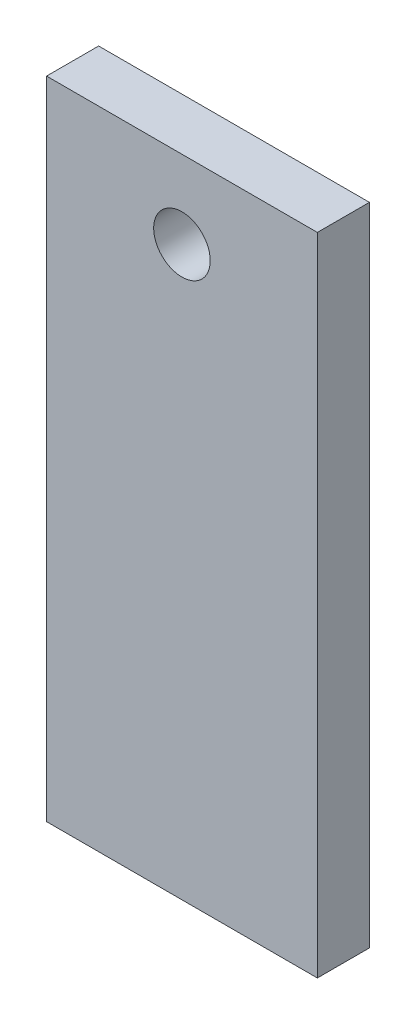
ISO-10303-21;
HEADER;
FILE_DESCRIPTION(('STEP AP214'),'2;1');
FILE_NAME('part.step','',(''),(''),'','','');
FILE_SCHEMA(('AUTOMOTIVE_DESIGN { 1 0 10303 214 1 1 1 1 }'));
ENDSEC;
DATA;
#1=APPLICATION_CONTEXT('core data for automotive mechanical design processes');
#2=APPLICATION_PROTOCOL_DEFINITION('international standard','automotive_design',2000,#1);
#3=PRODUCT_CONTEXT('',#1,'mechanical');
#4=PRODUCT('Part','Part','',(#3));
#5=PRODUCT_RELATED_PRODUCT_CATEGORY('part','',(#4));
#6=PRODUCT_DEFINITION_FORMATION('','',#4);
#7=PRODUCT_DEFINITION_CONTEXT('part definition',#1,'design');
#8=PRODUCT_DEFINITION('design','',#6,#7);
#9=PRODUCT_DEFINITION_SHAPE('','',#8);
#10=(LENGTH_UNIT() NAMED_UNIT(*) SI_UNIT(.MILLI.,.METRE.));
#11=(NAMED_UNIT(*) PLANE_ANGLE_UNIT() SI_UNIT($,.RADIAN.));
#12=(NAMED_UNIT(*) SI_UNIT($,.STERADIAN.) SOLID_ANGLE_UNIT());
#13=UNCERTAINTY_MEASURE_WITH_UNIT(LENGTH_MEASURE(1.E-05),#10,'distance_accuracy_value','');
#14=(GEOMETRIC_REPRESENTATION_CONTEXT(3) GLOBAL_UNCERTAINTY_ASSIGNED_CONTEXT((#13)) GLOBAL_UNIT_ASSIGNED_CONTEXT((#10,
#11,#12)) REPRESENTATION_CONTEXT('',''));
#15=CARTESIAN_POINT('',(0.,0.,0.));
#16=DIRECTION('',(0.,0.,1.));
#17=DIRECTION('',(1.,0.,0.));
#18=AXIS2_PLACEMENT_3D('',#15,#16,#17);
#19=CARTESIAN_POINT('',(0.,0.,0.));
#20=DIRECTION('',(0.,0.,1.));
#21=DIRECTION('',(1.,0.,0.));
#22=AXIS2_PLACEMENT_3D('',#19,#20,#21);
#23=PLANE('',#22);
#24=CARTESIAN_POINT('',(13.,54.5,0.));
#25=DIRECTION('',(0.,0.,1.));
#26=DIRECTION('',(1.,0.,0.));
#27=AXIS2_PLACEMENT_3D('',#24,#25,#26);
#28=CIRCLE('',#27,2.715);
#29=CARTESIAN_POINT('',(15.715,54.5,0.));
#30=VERTEX_POINT('',#29);
#31=EDGE_CURVE('E190',#30,#30,#28,.T.);
#32=ORIENTED_EDGE('',*,*,#31,.T.);
#33=EDGE_LOOP('',(#32));
#34=FACE_BOUND('',#33,.T.);
#35=DIRECTION('',(1.,0.,0.));
#36=VECTOR('',#35,1.);
#37=CARTESIAN_POINT('',(22.8452994616207,60.5,0.));
#38=LINE('',#37,#36);
#39=CARTESIAN_POINT('',(18.5256842193501,60.5,0.));
#40=VERTEX_POINT('',#39);
#41=CARTESIAN_POINT('',(23.3649147038914,60.5,0.));
#42=VERTEX_POINT('',#41);
#43=EDGE_CURVE('E235',#40,#42,#38,.T.);
#44=ORIENTED_EDGE('',*,*,#43,.F.);
#45=DIRECTION('',(0.,1.,0.));
#46=VECTOR('',#45,1.);
#47=CARTESIAN_POINT('',(18.5256842193501,0.,0.));
#48=LINE('',#47,#46);
#49=CARTESIAN_POINT('',(18.5256842193501,0.,0.));
#50=VERTEX_POINT('',#49);
#51=EDGE_CURVE('E308',#40,#50,#48,.F.);
#52=ORIENTED_EDGE('',*,*,#51,.T.);
#53=DIRECTION('',(1.,0.,0.));
#54=VECTOR('',#53,1.);
#55=CARTESIAN_POINT('',(0.,0.,0.));
#56=LINE('',#55,#54);
#57=CARTESIAN_POINT('',(7.47431578064993,0.,0.));
#58=VERTEX_POINT('',#57);
#59=EDGE_CURVE('E258',#58,#50,#56,.T.);
#60=ORIENTED_EDGE('',*,*,#59,.F.);
#61=DIRECTION('',(0.,1.,0.));
#62=VECTOR('',#61,1.);
#63=CARTESIAN_POINT('',(7.47431578064993,60.5,0.));
#64=LINE('',#63,#62);
#65=CARTESIAN_POINT('',(7.47431578064993,60.5,0.));
#66=VERTEX_POINT('',#65);
#67=EDGE_CURVE('E302',#58,#66,#64,.T.);
#68=ORIENTED_EDGE('',*,*,#67,.T.);
#69=DIRECTION('',(1.,0.,0.));
#70=VECTOR('',#69,1.);
#71=CARTESIAN_POINT('',(6.95470053837927,60.5,0.));
#72=LINE('',#71,#70);
#73=CARTESIAN_POINT('',(2.6350852961086,60.5,0.));
#74=VERTEX_POINT('',#73);
#75=EDGE_CURVE('E181',#74,#66,#72,.T.);
#76=ORIENTED_EDGE('',*,*,#75,.F.);
#77=DIRECTION('',(0.,1.,0.));
#78=VECTOR('',#77,1.);
#79=CARTESIAN_POINT('',(2.6350852961086,0.,0.));
#80=LINE('',#79,#78);
#81=CARTESIAN_POINT('',(2.6350852961086,0.,0.));
#82=VERTEX_POINT('',#81);
#83=EDGE_CURVE('E300',#74,#82,#80,.F.);
#84=ORIENTED_EDGE('',*,*,#83,.T.);
#85=CARTESIAN_POINT('',(0.,0.,0.));
#86=VERTEX_POINT('',#85);
#87=EDGE_CURVE('E254',#86,#82,#56,.T.);
#88=ORIENTED_EDGE('',*,*,#87,.F.);
#89=DIRECTION('',(0.,-1.,0.));
#90=VECTOR('',#89,1.);
#91=CARTESIAN_POINT('',(0.,0.,0.));
#92=LINE('',#91,#90);
#93=CARTESIAN_POINT('',(0.,62.,0.));
#94=VERTEX_POINT('',#93);
#95=EDGE_CURVE('E247',#94,#86,#92,.T.);
#96=ORIENTED_EDGE('',*,*,#95,.F.);
#97=DIRECTION('',(-1.,0.,0.));
#98=VECTOR('',#97,1.);
#99=CARTESIAN_POINT('',(0.,62.,0.));
#100=LINE('',#99,#98);
#101=CARTESIAN_POINT('',(26.,62.,0.));
#102=VERTEX_POINT('',#101);
#103=EDGE_CURVE('E260',#102,#94,#100,.T.);
#104=ORIENTED_EDGE('',*,*,#103,.F.);
#105=DIRECTION('',(0.,1.,0.));
#106=VECTOR('',#105,1.);
#107=CARTESIAN_POINT('',(26.,0.,0.));
#108=LINE('',#107,#106);
#109=CARTESIAN_POINT('',(26.,0.,0.));
#110=VERTEX_POINT('',#109);
#111=EDGE_CURVE('E257',#110,#102,#108,.T.);
#112=ORIENTED_EDGE('',*,*,#111,.F.);
#113=CARTESIAN_POINT('',(23.3649147038914,0.,0.));
#114=VERTEX_POINT('',#113);
#115=EDGE_CURVE('E240',#114,#110,#56,.T.);
#116=ORIENTED_EDGE('',*,*,#115,.F.);
#117=DIRECTION('',(0.,1.,0.));
#118=VECTOR('',#117,1.);
#119=CARTESIAN_POINT('',(23.3649147038914,60.5,0.));
#120=LINE('',#119,#118);
#121=EDGE_CURVE('E305',#114,#42,#120,.T.);
#122=ORIENTED_EDGE('',*,*,#121,.T.);
#123=EDGE_LOOP('',(#44,#52,#60,#68,#76,#84,#88,#96,#104,#112,#116,#122));
#124=FACE_BOUND('',#123,.T.);
#125=ADVANCED_FACE('F39',(#34,#124),#23,.F.);
#126=CARTESIAN_POINT('',(0.,0.,5.));
#127=DIRECTION('',(0.,1.,0.));
#128=DIRECTION('',(0.,0.,1.));
#129=AXIS2_PLACEMENT_3D('',#126,#127,#128);
#130=PLANE('',#129);
#131=ORIENTED_EDGE('',*,*,#59,.T.);
#132=CARTESIAN_POINT('',(18.5256842193501,0.,0.3));
#133=DIRECTION('',(0.,1.,0.));
#134=DIRECTION('',(0.,0.,1.));
#135=AXIS2_PLACEMENT_3D('',#132,#133,#134);
#136=CIRCLE('',#135,0.3);
#137=CARTESIAN_POINT('',(18.7854918404854,0.,0.450000000000004));
#138=VERTEX_POINT('',#137);
#139=EDGE_CURVE('E316',#50,#138,#136,.F.);
#140=ORIENTED_EDGE('',*,*,#139,.T.);
#141=DIRECTION('',(0.500000000000006,0.,-0.866025403784435));
#142=VECTOR('',#141,1.);
#143=CARTESIAN_POINT('',(12.1189110867543,0.,11.9968565782229));
#144=LINE('',#143,#142);
#145=CARTESIAN_POINT('',(17.8905989232415,0.,2.));
#146=VERTEX_POINT('',#145);
#147=EDGE_CURVE('E274',#146,#138,#144,.T.);
#148=ORIENTED_EDGE('',*,*,#147,.F.);
#149=DIRECTION('',(0.,0.,-1.));
#150=VECTOR('',#149,1.);
#151=CARTESIAN_POINT('',(17.8905989232415,0.,5.));
#152=LINE('',#151,#150);
#153=CARTESIAN_POINT('',(17.8905989232415,0.,2.6));
#154=VERTEX_POINT('',#153);
#155=EDGE_CURVE('E277',#154,#146,#152,.T.);
#156=ORIENTED_EDGE('',*,*,#155,.F.);
#157=DIRECTION('',(-1.,0.,0.));
#158=VECTOR('',#157,1.);
#159=CARTESIAN_POINT('',(0.,0.,2.6));
#160=LINE('',#159,#158);
#161=CARTESIAN_POINT('',(24.,0.,2.6));
#162=VERTEX_POINT('',#161);
#163=EDGE_CURVE('E280',#162,#154,#160,.T.);
#164=ORIENTED_EDGE('',*,*,#163,.F.);
#165=DIRECTION('',(0.,0.,1.));
#166=VECTOR('',#165,1.);
#167=CARTESIAN_POINT('',(24.,0.,5.));
#168=LINE('',#167,#166);
#169=CARTESIAN_POINT('',(24.,0.,2.));
#170=VERTEX_POINT('',#169);
#171=EDGE_CURVE('E282',#170,#162,#168,.T.);
#172=ORIENTED_EDGE('',*,*,#171,.F.);
#173=DIRECTION('',(0.500000000000004,0.,0.866025403784437));
#174=VECTOR('',#173,1.);
#175=CARTESIAN_POINT('',(19.2990381056766,0.,-6.14230484541332));
#176=LINE('',#175,#174);
#177=CARTESIAN_POINT('',(23.1051070827561,0.,0.450000000000005));
#178=VERTEX_POINT('',#177);
#179=EDGE_CURVE('E284',#178,#170,#176,.T.);
#180=ORIENTED_EDGE('',*,*,#179,.F.);
#181=CARTESIAN_POINT('',(23.3649147038914,0.,0.3));
#182=DIRECTION('',(0.,1.,0.));
#183=DIRECTION('',(0.,0.,1.));
#184=AXIS2_PLACEMENT_3D('',#181,#182,#183);
#185=CIRCLE('',#184,0.3);
#186=EDGE_CURVE('E314',#178,#114,#185,.F.);
#187=ORIENTED_EDGE('',*,*,#186,.T.);
#188=ORIENTED_EDGE('',*,*,#115,.T.);
#189=DIRECTION('',(0.,0.,-1.));
#190=VECTOR('',#189,1.);
#191=CARTESIAN_POINT('',(26.,0.,5.));
#192=LINE('',#191,#190);
#193=CARTESIAN_POINT('',(26.,0.,5.));
#194=VERTEX_POINT('',#193);
#195=EDGE_CURVE('E271',#194,#110,#192,.T.);
#196=ORIENTED_EDGE('',*,*,#195,.F.);
#197=DIRECTION('',(1.,0.,0.));
#198=VECTOR('',#197,1.);
#199=CARTESIAN_POINT('',(0.,0.,5.));
#200=LINE('',#199,#198);
#201=CARTESIAN_POINT('',(0.,0.,5.));
#202=VERTEX_POINT('',#201);
#203=EDGE_CURVE('E243',#202,#194,#200,.T.);
#204=ORIENTED_EDGE('',*,*,#203,.F.);
#205=DIRECTION('',(0.,0.,-1.));
#206=VECTOR('',#205,1.);
#207=CARTESIAN_POINT('',(0.,0.,5.));
#208=LINE('',#207,#206);
#209=EDGE_CURVE('E253',#202,#86,#208,.T.);
#210=ORIENTED_EDGE('',*,*,#209,.T.);
#211=ORIENTED_EDGE('',*,*,#87,.T.);
#212=CARTESIAN_POINT('',(2.6350852961086,0.,0.3));
#213=DIRECTION('',(0.,1.,0.));
#214=DIRECTION('',(0.,0.,1.));
#215=AXIS2_PLACEMENT_3D('',#212,#213,#214);
#216=CIRCLE('',#215,0.3);
#217=CARTESIAN_POINT('',(2.89489291724393,0.,0.450000000000003));
#218=VERTEX_POINT('',#217);
#219=EDGE_CURVE('E310',#82,#218,#216,.F.);
#220=ORIENTED_EDGE('',*,*,#219,.T.);
#221=DIRECTION('',(0.500000000000006,0.,-0.866025403784435));
#222=VECTOR('',#221,1.);
#223=CARTESIAN_POINT('',(0.200961894323318,0.,5.11602540378443));
#224=LINE('',#223,#222);
#225=CARTESIAN_POINT('',(2.,0.,2.));
#226=VERTEX_POINT('',#225);
#227=EDGE_CURVE('E286',#226,#218,#224,.T.);
#228=ORIENTED_EDGE('',*,*,#227,.F.);
#229=DIRECTION('',(0.,0.,-1.));
#230=VECTOR('',#229,1.);
#231=CARTESIAN_POINT('',(2.,0.,5.));
#232=LINE('',#231,#230);
#233=CARTESIAN_POINT('',(2.,0.,2.6));
#234=VERTEX_POINT('',#233);
#235=EDGE_CURVE('E289',#234,#226,#232,.T.);
#236=ORIENTED_EDGE('',*,*,#235,.F.);
#237=DIRECTION('',(-1.,0.,0.));
#238=VECTOR('',#237,1.);
#239=CARTESIAN_POINT('',(0.,0.,2.6));
#240=LINE('',#239,#238);
#241=CARTESIAN_POINT('',(8.10940107675853,0.,2.6));
#242=VERTEX_POINT('',#241);
#243=EDGE_CURVE('E292',#242,#234,#240,.T.);
#244=ORIENTED_EDGE('',*,*,#243,.F.);
#245=DIRECTION('',(0.,0.,1.));
#246=VECTOR('',#245,1.);
#247=CARTESIAN_POINT('',(8.10940107675853,0.,5.));
#248=LINE('',#247,#246);
#249=CARTESIAN_POINT('',(8.10940107675853,0.,2.));
#250=VERTEX_POINT('',#249);
#251=EDGE_CURVE('E294',#250,#242,#248,.T.);
#252=ORIENTED_EDGE('',*,*,#251,.F.);
#253=DIRECTION('',(0.500000000000004,0.,0.866025403784437));
#254=VECTOR('',#253,1.);
#255=CARTESIAN_POINT('',(7.38108891324553,0.,0.738526329025088));
#256=LINE('',#255,#254);
#257=CARTESIAN_POINT('',(7.2145081595146,0.,0.450000000000001));
#258=VERTEX_POINT('',#257);
#259=EDGE_CURVE('E187',#258,#250,#256,.T.);
#260=ORIENTED_EDGE('',*,*,#259,.F.);
#261=CARTESIAN_POINT('',(7.47431578064993,0.,0.3));
#262=DIRECTION('',(0.,1.,0.));
#263=DIRECTION('',(0.,0.,1.));
#264=AXIS2_PLACEMENT_3D('',#261,#262,#263);
#265=CIRCLE('',#264,0.3);
#266=EDGE_CURVE('E312',#258,#58,#265,.F.);
#267=ORIENTED_EDGE('',*,*,#266,.T.);
#268=EDGE_LOOP('',(#131,#140,#148,#156,#164,#172,#180,#187,#188,#196,#204,#210,#211,#220,#228,
#236,#244,#252,#260,#267));
#269=FACE_BOUND('',#268,.T.);
#270=ADVANCED_FACE('F345',(#269),#130,.F.);
#271=CARTESIAN_POINT('',(0.,0.,5.));
#272=DIRECTION('',(0.,0.,1.));
#273=DIRECTION('',(1.,0.,0.));
#274=AXIS2_PLACEMENT_3D('',#271,#272,#273);
#275=PLANE('',#274);
#276=ORIENTED_EDGE('',*,*,#203,.T.);
#277=DIRECTION('',(0.,1.,0.));
#278=VECTOR('',#277,1.);
#279=CARTESIAN_POINT('',(26.,0.,5.));
#280=LINE('',#279,#278);
#281=CARTESIAN_POINT('',(26.,62.,5.));
#282=VERTEX_POINT('',#281);
#283=EDGE_CURVE('E246',#194,#282,#280,.T.);
#284=ORIENTED_EDGE('',*,*,#283,.T.);
#285=DIRECTION('',(-1.,0.,0.));
#286=VECTOR('',#285,1.);
#287=CARTESIAN_POINT('',(0.,62.,5.));
#288=LINE('',#287,#286);
#289=CARTESIAN_POINT('',(0.,62.,5.));
#290=VERTEX_POINT('',#289);
#291=EDGE_CURVE('E249',#282,#290,#288,.T.);
#292=ORIENTED_EDGE('',*,*,#291,.T.);
#293=DIRECTION('',(0.,-1.,0.));
#294=VECTOR('',#293,1.);
#295=CARTESIAN_POINT('',(0.,0.,5.));
#296=LINE('',#295,#294);
#297=EDGE_CURVE('E251',#290,#202,#296,.T.);
#298=ORIENTED_EDGE('',*,*,#297,.T.);
#299=EDGE_LOOP('',(#276,#284,#292,#298));
#300=FACE_BOUND('',#299,.T.);
#301=CARTESIAN_POINT('',(13.,54.5,5.));
#302=DIRECTION('',(0.,0.,1.));
#303=DIRECTION('',(1.,0.,0.));
#304=AXIS2_PLACEMENT_3D('',#301,#302,#303);
#305=CIRCLE('',#304,2.715);
#306=CARTESIAN_POINT('',(15.715,54.5,5.));
#307=VERTEX_POINT('',#306);
#308=EDGE_CURVE('E237',#307,#307,#305,.T.);
#309=ORIENTED_EDGE('',*,*,#308,.F.);
#310=EDGE_LOOP('',(#309));
#311=FACE_BOUND('',#310,.T.);
#312=ADVANCED_FACE('F390',(#300,#311),#275,.T.);
#313=CARTESIAN_POINT('',(26.,0.,5.));
#314=DIRECTION('',(-1.,0.,0.));
#315=DIRECTION('',(0.,0.,1.));
#316=AXIS2_PLACEMENT_3D('',#313,#314,#315);
#317=PLANE('',#316);
#318=ORIENTED_EDGE('',*,*,#111,.T.);
#319=DIRECTION('',(0.,0.,-1.));
#320=VECTOR('',#319,1.);
#321=CARTESIAN_POINT('',(26.,62.,5.));
#322=LINE('',#321,#320);
#323=EDGE_CURVE('E268',#282,#102,#322,.T.);
#324=ORIENTED_EDGE('',*,*,#323,.F.);
#325=ORIENTED_EDGE('',*,*,#283,.F.);
#326=ORIENTED_EDGE('',*,*,#195,.T.);
#327=EDGE_LOOP('',(#318,#324,#325,#326));
#328=FACE_BOUND('',#327,.T.);
#329=ADVANCED_FACE('F402',(#328),#317,.F.);
#330=CARTESIAN_POINT('',(0.,62.,5.));
#331=DIRECTION('',(0.,-1.,0.));
#332=DIRECTION('',(0.,0.,-1.));
#333=AXIS2_PLACEMENT_3D('',#330,#331,#332);
#334=PLANE('',#333);
#335=ORIENTED_EDGE('',*,*,#103,.T.);
#336=DIRECTION('',(0.,0.,-1.));
#337=VECTOR('',#336,1.);
#338=CARTESIAN_POINT('',(0.,62.,5.));
#339=LINE('',#338,#337);
#340=EDGE_CURVE('E265',#290,#94,#339,.T.);
#341=ORIENTED_EDGE('',*,*,#340,.F.);
#342=ORIENTED_EDGE('',*,*,#291,.F.);
#343=ORIENTED_EDGE('',*,*,#323,.T.);
#344=EDGE_LOOP('',(#335,#341,#342,#343));
#345=FACE_BOUND('',#344,.T.);
#346=ADVANCED_FACE('F398',(#345),#334,.F.);
#347=CARTESIAN_POINT('',(0.,0.,5.));
#348=DIRECTION('',(1.,0.,0.));
#349=DIRECTION('',(0.,0.,-1.));
#350=AXIS2_PLACEMENT_3D('',#347,#348,#349);
#351=PLANE('',#350);
#352=ORIENTED_EDGE('',*,*,#95,.T.);
#353=ORIENTED_EDGE('',*,*,#209,.F.);
#354=ORIENTED_EDGE('',*,*,#297,.F.);
#355=ORIENTED_EDGE('',*,*,#340,.T.);
#356=EDGE_LOOP('',(#352,#353,#354,#355));
#357=FACE_BOUND('',#356,.T.);
#358=ADVANCED_FACE('F395',(#357),#351,.F.);
#359=CARTESIAN_POINT('',(13.,54.5,5.));
#360=DIRECTION('',(0.,0.,-1.));
#361=DIRECTION('',(-1.,0.,0.));
#362=AXIS2_PLACEMENT_3D('',#359,#360,#361);
#363=CYLINDRICAL_SURFACE('',#362,2.715);
#364=ORIENTED_EDGE('',*,*,#308,.T.);
#365=EDGE_LOOP('',(#364));
#366=FACE_BOUND('',#365,.T.);
#367=ORIENTED_EDGE('',*,*,#31,.F.);
#368=EDGE_LOOP('',(#367));
#369=FACE_BOUND('',#368,.T.);
#370=ADVANCED_FACE('F382',(#366,#369),#363,.F.);
#371=CARTESIAN_POINT('',(24.,-1.2E-05,2.));
#372=DIRECTION('',(-0.866025403784436,0.,0.500000000000004));
#373=DIRECTION('',(0.500000000000004,0.,0.866025403784437));
#374=AXIS2_PLACEMENT_3D('',#371,#372,#373);
#375=PLANE('',#374);
#376=DIRECTION('',(0.500000000000004,0.,0.866025403784436));
#377=VECTOR('',#376,1.);
#378=CARTESIAN_POINT('',(24.,60.5,2.));
#379=LINE('',#378,#377);
#380=CARTESIAN_POINT('',(23.1051070827561,60.5,0.450000000000001));
#381=VERTEX_POINT('',#380);
#382=CARTESIAN_POINT('',(24.,60.5,2.));
#383=VERTEX_POINT('',#382);
#384=EDGE_CURVE('E233',#381,#383,#379,.T.);
#385=ORIENTED_EDGE('',*,*,#384,.F.);
#386=DIRECTION('',(0.,1.,0.));
#387=VECTOR('',#386,1.);
#388=CARTESIAN_POINT('',(23.1051070827561,0.,0.450000000000001));
#389=LINE('',#388,#387);
#390=EDGE_CURVE('E318',#381,#178,#389,.F.);
#391=ORIENTED_EDGE('',*,*,#390,.T.);
#392=ORIENTED_EDGE('',*,*,#179,.T.);
#393=DIRECTION('',(0.,1.,0.));
#394=VECTOR('',#393,1.);
#395=CARTESIAN_POINT('',(24.,-1.2E-05,2.));
#396=LINE('',#395,#394);
#397=EDGE_CURVE('E212',#170,#383,#396,.T.);
#398=ORIENTED_EDGE('',*,*,#397,.T.);
#399=EDGE_LOOP('',(#385,#391,#392,#398));
#400=FACE_BOUND('',#399,.T.);
#401=ADVANCED_FACE('F336',(#400),#375,.T.);
#402=CARTESIAN_POINT('',(24.,-1.2E-05,2.));
#403=DIRECTION('',(-1.,0.,0.));
#404=DIRECTION('',(0.,0.,1.));
#405=AXIS2_PLACEMENT_3D('',#402,#403,#404);
#406=PLANE('',#405);
#407=ORIENTED_EDGE('',*,*,#171,.T.);
#408=DIRECTION('',(0.,1.,0.));
#409=VECTOR('',#408,1.);
#410=CARTESIAN_POINT('',(24.,-1.2E-05,2.6));
#411=LINE('',#410,#409);
#412=CARTESIAN_POINT('',(24.,60.5,2.6));
#413=VERTEX_POINT('',#412);
#414=EDGE_CURVE('E215',#162,#413,#411,.T.);
#415=ORIENTED_EDGE('',*,*,#414,.T.);
#416=DIRECTION('',(0.,0.,1.));
#417=VECTOR('',#416,1.);
#418=CARTESIAN_POINT('',(24.,60.5,2.));
#419=LINE('',#418,#417);
#420=EDGE_CURVE('E230',#383,#413,#419,.T.);
#421=ORIENTED_EDGE('',*,*,#420,.F.);
#422=ORIENTED_EDGE('',*,*,#397,.F.);
#423=EDGE_LOOP('',(#407,#415,#421,#422));
#424=FACE_BOUND('',#423,.T.);
#425=ADVANCED_FACE('F374',(#424),#406,.T.);
#426=CARTESIAN_POINT('',(17.8905989232415,-1.2E-05,2.6));
#427=DIRECTION('',(0.,0.,-1.));
#428=DIRECTION('',(-1.,0.,0.));
#429=AXIS2_PLACEMENT_3D('',#426,#427,#428);
#430=PLANE('',#429);
#431=ORIENTED_EDGE('',*,*,#163,.T.);
#432=DIRECTION('',(0.,1.,0.));
#433=VECTOR('',#432,1.);
#434=CARTESIAN_POINT('',(17.8905989232415,-1.2E-05,2.6));
#435=LINE('',#434,#433);
#436=CARTESIAN_POINT('',(17.8905989232415,60.5,2.6));
#437=VERTEX_POINT('',#436);
#438=EDGE_CURVE('E217',#154,#437,#435,.T.);
#439=ORIENTED_EDGE('',*,*,#438,.T.);
#440=DIRECTION('',(-1.,0.,0.));
#441=VECTOR('',#440,1.);
#442=CARTESIAN_POINT('',(17.8905989232415,60.5,2.6));
#443=LINE('',#442,#441);
#444=EDGE_CURVE('E227',#413,#437,#443,.T.);
#445=ORIENTED_EDGE('',*,*,#444,.F.);
#446=ORIENTED_EDGE('',*,*,#414,.F.);
#447=EDGE_LOOP('',(#431,#439,#445,#446));
#448=FACE_BOUND('',#447,.T.);
#449=ADVANCED_FACE('F372',(#448),#430,.T.);
#450=CARTESIAN_POINT('',(17.8905989232415,-1.2E-05,2.));
#451=DIRECTION('',(1.,0.,0.));
#452=DIRECTION('',(0.,0.,-1.));
#453=AXIS2_PLACEMENT_3D('',#450,#451,#452);
#454=PLANE('',#453);
#455=ORIENTED_EDGE('',*,*,#155,.T.);
#456=DIRECTION('',(0.,1.,0.));
#457=VECTOR('',#456,1.);
#458=CARTESIAN_POINT('',(17.8905989232415,-1.2E-05,2.));
#459=LINE('',#458,#457);
#460=CARTESIAN_POINT('',(17.8905989232415,60.5,2.));
#461=VERTEX_POINT('',#460);
#462=EDGE_CURVE('E219',#146,#461,#459,.T.);
#463=ORIENTED_EDGE('',*,*,#462,.T.);
#464=DIRECTION('',(0.,0.,-1.));
#465=VECTOR('',#464,1.);
#466=CARTESIAN_POINT('',(17.8905989232415,60.5,2.));
#467=LINE('',#466,#465);
#468=EDGE_CURVE('E224',#437,#461,#467,.T.);
#469=ORIENTED_EDGE('',*,*,#468,.F.);
#470=ORIENTED_EDGE('',*,*,#438,.F.);
#471=EDGE_LOOP('',(#455,#463,#469,#470));
#472=FACE_BOUND('',#471,.T.);
#473=ADVANCED_FACE('F367',(#472),#454,.T.);
#474=CARTESIAN_POINT('',(19.0452994616207,-1.2E-05,0.));
#475=DIRECTION('',(0.866025403784435,0.,0.500000000000006));
#476=DIRECTION('',(0.500000000000006,0.,-0.866025403784435));
#477=AXIS2_PLACEMENT_3D('',#474,#475,#476);
#478=PLANE('',#477);
#479=ORIENTED_EDGE('',*,*,#147,.T.);
#480=DIRECTION('',(0.,1.,0.));
#481=VECTOR('',#480,1.);
#482=CARTESIAN_POINT('',(18.7854918404854,60.5,0.450000000000003));
#483=LINE('',#482,#481);
#484=CARTESIAN_POINT('',(18.7854918404854,60.5,0.450000000000004));
#485=VERTEX_POINT('',#484);
#486=EDGE_CURVE('E297',#138,#485,#483,.T.);
#487=ORIENTED_EDGE('',*,*,#486,.T.);
#488=DIRECTION('',(0.500000000000006,0.,-0.866025403784435));
#489=VECTOR('',#488,1.);
#490=CARTESIAN_POINT('',(19.0452994616207,60.5,0.));
#491=LINE('',#490,#489);
#492=EDGE_CURVE('E221',#461,#485,#491,.T.);
#493=ORIENTED_EDGE('',*,*,#492,.F.);
#494=ORIENTED_EDGE('',*,*,#462,.F.);
#495=EDGE_LOOP('',(#479,#487,#493,#494));
#496=FACE_BOUND('',#495,.T.);
#497=ADVANCED_FACE('F362',(#496),#478,.T.);
#498=CARTESIAN_POINT('',(0.,60.5,0.));
#499=DIRECTION('',(0.,1.,0.));
#500=DIRECTION('',(0.,0.,1.));
#501=AXIS2_PLACEMENT_3D('',#498,#499,#500);
#502=PLANE('',#501);
#503=ORIENTED_EDGE('',*,*,#43,.T.);
#504=CARTESIAN_POINT('',(23.3649147038914,60.5,0.3));
#505=DIRECTION('',(0.,1.,0.));
#506=DIRECTION('',(0.,0.,1.));
#507=AXIS2_PLACEMENT_3D('',#504,#505,#506);
#508=CIRCLE('',#507,0.3);
#509=EDGE_CURVE('E327',#42,#381,#508,.T.);
#510=ORIENTED_EDGE('',*,*,#509,.T.);
#511=ORIENTED_EDGE('',*,*,#384,.T.);
#512=ORIENTED_EDGE('',*,*,#420,.T.);
#513=ORIENTED_EDGE('',*,*,#444,.T.);
#514=ORIENTED_EDGE('',*,*,#468,.T.);
#515=ORIENTED_EDGE('',*,*,#492,.T.);
#516=CARTESIAN_POINT('',(18.5256842193501,60.5,0.3));
#517=DIRECTION('',(0.,1.,0.));
#518=DIRECTION('',(0.,0.,1.));
#519=AXIS2_PLACEMENT_3D('',#516,#517,#518);
#520=CIRCLE('',#519,0.3);
#521=EDGE_CURVE('E324',#485,#40,#520,.T.);
#522=ORIENTED_EDGE('',*,*,#521,.T.);
#523=EDGE_LOOP('',(#503,#510,#511,#512,#513,#514,#515,#522));
#524=FACE_BOUND('',#523,.T.);
#525=ADVANCED_FACE('F331',(#524),#502,.F.);
#526=CARTESIAN_POINT('',(8.10940107675853,-1.2E-05,2.));
#527=DIRECTION('',(-0.866025403784436,0.,0.500000000000004));
#528=DIRECTION('',(0.500000000000004,0.,0.866025403784437));
#529=AXIS2_PLACEMENT_3D('',#526,#527,#528);
#530=PLANE('',#529);
#531=DIRECTION('',(0.500000000000004,0.,0.866025403784436));
#532=VECTOR('',#531,1.);
#533=CARTESIAN_POINT('',(8.10940107675853,60.5,2.));
#534=LINE('',#533,#532);
#535=CARTESIAN_POINT('',(7.2145081595146,60.5,0.450000000000002));
#536=VERTEX_POINT('',#535);
#537=CARTESIAN_POINT('',(8.10940107675853,60.5,2.));
#538=VERTEX_POINT('',#537);
#539=EDGE_CURVE('E173',#536,#538,#534,.T.);
#540=ORIENTED_EDGE('',*,*,#539,.F.);
#541=DIRECTION('',(0.,1.,0.));
#542=VECTOR('',#541,1.);
#543=CARTESIAN_POINT('',(7.2145081595146,0.,0.450000000000001));
#544=LINE('',#543,#542);
#545=EDGE_CURVE('E320',#536,#258,#544,.F.);
#546=ORIENTED_EDGE('',*,*,#545,.T.);
#547=ORIENTED_EDGE('',*,*,#259,.T.);
#548=DIRECTION('',(0.,1.,0.));
#549=VECTOR('',#548,1.);
#550=CARTESIAN_POINT('',(8.10940107675853,-1.2E-05,2.));
#551=LINE('',#550,#549);
#552=EDGE_CURVE('E184',#250,#538,#551,.T.);
#553=ORIENTED_EDGE('',*,*,#552,.T.);
#554=EDGE_LOOP('',(#540,#546,#547,#553));
#555=FACE_BOUND('',#554,.T.);
#556=ADVANCED_FACE('F185',(#555),#530,.T.);
#557=CARTESIAN_POINT('',(8.10940107675853,-1.2E-05,2.));
#558=DIRECTION('',(-1.,0.,0.));
#559=DIRECTION('',(0.,0.,1.));
#560=AXIS2_PLACEMENT_3D('',#557,#558,#559);
#561=PLANE('',#560);
#562=ORIENTED_EDGE('',*,*,#251,.T.);
#563=DIRECTION('',(0.,1.,0.));
#564=VECTOR('',#563,1.);
#565=CARTESIAN_POINT('',(8.10940107675853,-1.2E-05,2.6));
#566=LINE('',#565,#564);
#567=CARTESIAN_POINT('',(8.10940107675853,60.5,2.6));
#568=VERTEX_POINT('',#567);
#569=EDGE_CURVE('E191',#242,#568,#566,.T.);
#570=ORIENTED_EDGE('',*,*,#569,.T.);
#571=DIRECTION('',(0.,0.,1.));
#572=VECTOR('',#571,1.);
#573=CARTESIAN_POINT('',(8.10940107675853,60.5,2.));
#574=LINE('',#573,#572);
#575=EDGE_CURVE('E178',#538,#568,#574,.T.);
#576=ORIENTED_EDGE('',*,*,#575,.F.);
#577=ORIENTED_EDGE('',*,*,#552,.F.);
#578=EDGE_LOOP('',(#562,#570,#576,#577));
#579=FACE_BOUND('',#578,.T.);
#580=ADVANCED_FACE('F193',(#579),#561,.T.);
#581=CARTESIAN_POINT('',(2.,-1.2E-05,2.6));
#582=DIRECTION('',(0.,0.,-1.));
#583=DIRECTION('',(-1.,0.,0.));
#584=AXIS2_PLACEMENT_3D('',#581,#582,#583);
#585=PLANE('',#584);
#586=ORIENTED_EDGE('',*,*,#243,.T.);
#587=DIRECTION('',(0.,1.,0.));
#588=VECTOR('',#587,1.);
#589=CARTESIAN_POINT('',(2.,-1.2E-05,2.6));
#590=LINE('',#589,#588);
#591=CARTESIAN_POINT('',(2.,60.5,2.6));
#592=VERTEX_POINT('',#591);
#593=EDGE_CURVE('E209',#234,#592,#590,.T.);
#594=ORIENTED_EDGE('',*,*,#593,.T.);
#595=DIRECTION('',(-1.,0.,0.));
#596=VECTOR('',#595,1.);
#597=CARTESIAN_POINT('',(2.,60.5,2.6));
#598=LINE('',#597,#596);
#599=EDGE_CURVE('E196',#568,#592,#598,.T.);
#600=ORIENTED_EDGE('',*,*,#599,.F.);
#601=ORIENTED_EDGE('',*,*,#569,.F.);
#602=EDGE_LOOP('',(#586,#594,#600,#601));
#603=FACE_BOUND('',#602,.T.);
#604=ADVANCED_FACE('F429',(#603),#585,.T.);
#605=CARTESIAN_POINT('',(2.,-1.2E-05,2.));
#606=DIRECTION('',(1.,0.,0.));
#607=DIRECTION('',(0.,0.,-1.));
#608=AXIS2_PLACEMENT_3D('',#605,#606,#607);
#609=PLANE('',#608);
#610=ORIENTED_EDGE('',*,*,#235,.T.);
#611=DIRECTION('',(0.,1.,0.));
#612=VECTOR('',#611,1.);
#613=CARTESIAN_POINT('',(2.,-1.2E-05,2.));
#614=LINE('',#613,#612);
#615=CARTESIAN_POINT('',(2.,60.5,2.));
#616=VERTEX_POINT('',#615);
#617=EDGE_CURVE('E207',#226,#616,#614,.T.);
#618=ORIENTED_EDGE('',*,*,#617,.T.);
#619=DIRECTION('',(0.,0.,-1.));
#620=VECTOR('',#619,1.);
#621=CARTESIAN_POINT('',(2.,60.5,2.));
#622=LINE('',#621,#620);
#623=EDGE_CURVE('E198',#592,#616,#622,.T.);
#624=ORIENTED_EDGE('',*,*,#623,.F.);
#625=ORIENTED_EDGE('',*,*,#593,.F.);
#626=EDGE_LOOP('',(#610,#618,#624,#625));
#627=FACE_BOUND('',#626,.T.);
#628=ADVANCED_FACE('F426',(#627),#609,.T.);
#629=CARTESIAN_POINT('',(3.15470053837927,-1.2E-05,0.));
#630=DIRECTION('',(0.866025403784435,0.,0.500000000000006));
#631=DIRECTION('',(0.500000000000006,0.,-0.866025403784435));
#632=AXIS2_PLACEMENT_3D('',#629,#630,#631);
#633=PLANE('',#632);
#634=ORIENTED_EDGE('',*,*,#227,.T.);
#635=DIRECTION('',(0.,1.,0.));
#636=VECTOR('',#635,1.);
#637=CARTESIAN_POINT('',(2.89489291724393,60.5,0.450000000000002));
#638=LINE('',#637,#636);
#639=CARTESIAN_POINT('',(2.89489291724393,60.5,0.450000000000002));
#640=VERTEX_POINT('',#639);
#641=EDGE_CURVE('E322',#218,#640,#638,.T.);
#642=ORIENTED_EDGE('',*,*,#641,.T.);
#643=DIRECTION('',(0.500000000000006,0.,-0.866025403784435));
#644=VECTOR('',#643,1.);
#645=CARTESIAN_POINT('',(3.15470053837927,60.5,0.));
#646=LINE('',#645,#644);
#647=EDGE_CURVE('E204',#616,#640,#646,.T.);
#648=ORIENTED_EDGE('',*,*,#647,.F.);
#649=ORIENTED_EDGE('',*,*,#617,.F.);
#650=EDGE_LOOP('',(#634,#642,#648,#649));
#651=FACE_BOUND('',#650,.T.);
#652=ADVANCED_FACE('F422',(#651),#633,.T.);
#653=CARTESIAN_POINT('',(0.,60.5,0.));
#654=DIRECTION('',(0.,1.,0.));
#655=DIRECTION('',(0.,0.,1.));
#656=AXIS2_PLACEMENT_3D('',#653,#654,#655);
#657=PLANE('',#656);
#658=ORIENTED_EDGE('',*,*,#75,.T.);
#659=CARTESIAN_POINT('',(7.47431578064993,60.5,0.3));
#660=DIRECTION('',(0.,1.,0.));
#661=DIRECTION('',(0.,0.,1.));
#662=AXIS2_PLACEMENT_3D('',#659,#660,#661);
#663=CIRCLE('',#662,0.3);
#664=EDGE_CURVE('E47',#66,#536,#663,.T.);
#665=ORIENTED_EDGE('',*,*,#664,.T.);
#666=ORIENTED_EDGE('',*,*,#539,.T.);
#667=ORIENTED_EDGE('',*,*,#575,.T.);
#668=ORIENTED_EDGE('',*,*,#599,.T.);
#669=ORIENTED_EDGE('',*,*,#623,.T.);
#670=ORIENTED_EDGE('',*,*,#647,.T.);
#671=CARTESIAN_POINT('',(2.6350852961086,60.5,0.3));
#672=DIRECTION('',(0.,1.,0.));
#673=DIRECTION('',(0.,0.,1.));
#674=AXIS2_PLACEMENT_3D('',#671,#672,#673);
#675=CIRCLE('',#674,0.3);
#676=EDGE_CURVE('E11',#640,#74,#675,.T.);
#677=ORIENTED_EDGE('',*,*,#676,.T.);
#678=EDGE_LOOP('',(#658,#665,#666,#667,#668,#669,#670,#677));
#679=FACE_BOUND('',#678,.T.);
#680=ADVANCED_FACE('F175',(#679),#657,.F.);
#681=CARTESIAN_POINT('',(18.5256842193501,-1.2E-05,0.3));
#682=DIRECTION('',(0.,-1.,0.));
#683=DIRECTION('',(0.,0.,-1.));
#684=AXIS2_PLACEMENT_3D('',#681,#682,#683);
#685=CYLINDRICAL_SURFACE('',#684,0.3);
#686=ORIENTED_EDGE('',*,*,#139,.F.);
#687=ORIENTED_EDGE('',*,*,#51,.F.);
#688=ORIENTED_EDGE('',*,*,#521,.F.);
#689=ORIENTED_EDGE('',*,*,#486,.F.);
#690=EDGE_LOOP('',(#686,#687,#688,#689));
#691=FACE_BOUND('',#690,.T.);
#692=ADVANCED_FACE('F359',(#691),#685,.T.);
#693=CARTESIAN_POINT('',(23.3649147038914,0.,0.3));
#694=DIRECTION('',(0.,-1.,0.));
#695=DIRECTION('',(0.,0.,-1.));
#696=AXIS2_PLACEMENT_3D('',#693,#694,#695);
#697=CYLINDRICAL_SURFACE('',#696,0.3);
#698=ORIENTED_EDGE('',*,*,#186,.F.);
#699=ORIENTED_EDGE('',*,*,#390,.F.);
#700=ORIENTED_EDGE('',*,*,#509,.F.);
#701=ORIENTED_EDGE('',*,*,#121,.F.);
#702=EDGE_LOOP('',(#698,#699,#700,#701));
#703=FACE_BOUND('',#702,.T.);
#704=ADVANCED_FACE('F341',(#703),#697,.T.);
#705=CARTESIAN_POINT('',(7.47431578064993,0.,0.3));
#706=DIRECTION('',(0.,-1.,0.));
#707=DIRECTION('',(0.,0.,-1.));
#708=AXIS2_PLACEMENT_3D('',#705,#706,#707);
#709=CYLINDRICAL_SURFACE('',#708,0.3);
#710=ORIENTED_EDGE('',*,*,#266,.F.);
#711=ORIENTED_EDGE('',*,*,#545,.F.);
#712=ORIENTED_EDGE('',*,*,#664,.F.);
#713=ORIENTED_EDGE('',*,*,#67,.F.);
#714=EDGE_LOOP('',(#710,#711,#712,#713));
#715=FACE_BOUND('',#714,.T.);
#716=ADVANCED_FACE('F410',(#715),#709,.T.);
#717=CARTESIAN_POINT('',(2.6350852961086,-1.2E-05,0.3));
#718=DIRECTION('',(0.,-1.,0.));
#719=DIRECTION('',(0.,0.,-1.));
#720=AXIS2_PLACEMENT_3D('',#717,#718,#719);
#721=CYLINDRICAL_SURFACE('',#720,0.3);
#722=ORIENTED_EDGE('',*,*,#219,.F.);
#723=ORIENTED_EDGE('',*,*,#83,.F.);
#724=ORIENTED_EDGE('',*,*,#676,.F.);
#725=ORIENTED_EDGE('',*,*,#641,.F.);
#726=EDGE_LOOP('',(#722,#723,#724,#725));
#727=FACE_BOUND('',#726,.T.);
#728=ADVANCED_FACE('F41',(#727),#721,.T.);
#729=CLOSED_SHELL('',(#125,#270,#312,#329,#346,#358,#370,#401,#425,#449,#473,#497,#525,#556,
#580,#604,#628,#652,#680,#692,#704,#716,#728));
#730=MANIFOLD_SOLID_BREP('B2',#729);
#731=ADVANCED_BREP_SHAPE_REPRESENTATION('',(#18,#730),#14);
#732=SHAPE_DEFINITION_REPRESENTATION(#9,#731);
ENDSEC;
END-ISO-10303-21;
